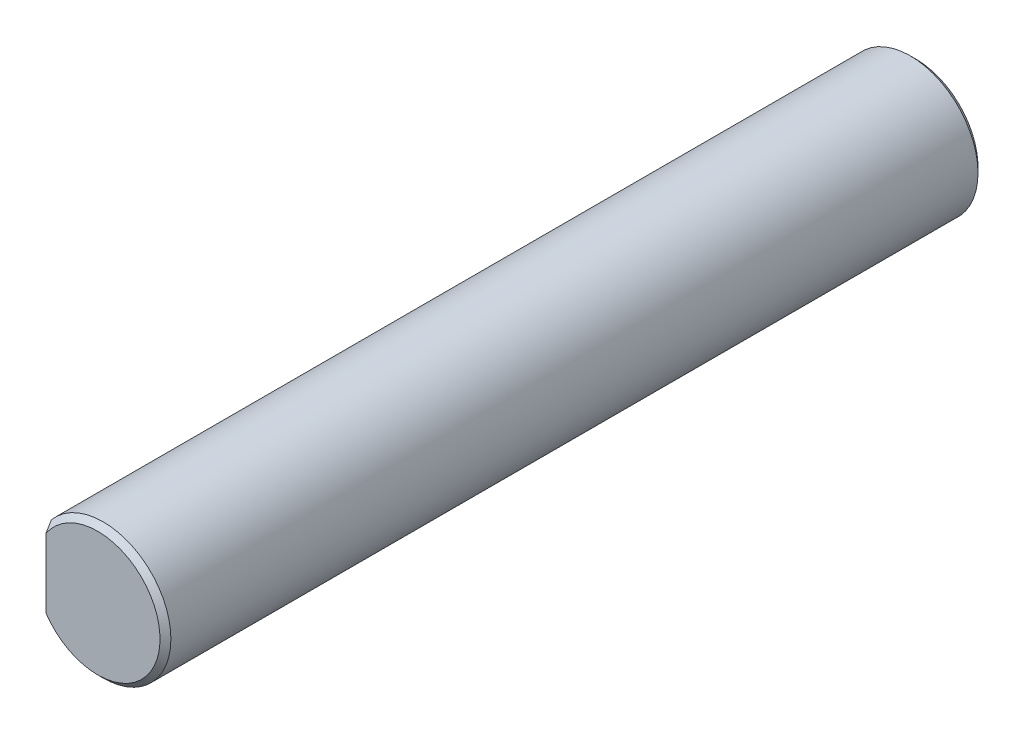
ISO-10303-21;
HEADER;
FILE_DESCRIPTION(('STEP AP214'),'2;1');
FILE_NAME('part.step','',(''),(''),'','','');
FILE_SCHEMA(('AUTOMOTIVE_DESIGN { 1 0 10303 214 1 1 1 1 }'));
ENDSEC;
DATA;
#1=APPLICATION_CONTEXT('core data for automotive mechanical design processes');
#2=APPLICATION_PROTOCOL_DEFINITION('international standard','automotive_design',2000,#1);
#3=PRODUCT_CONTEXT('',#1,'mechanical');
#4=PRODUCT('Part','Part','',(#3));
#5=PRODUCT_RELATED_PRODUCT_CATEGORY('part','',(#4));
#6=PRODUCT_DEFINITION_FORMATION('','',#4);
#7=PRODUCT_DEFINITION_CONTEXT('part definition',#1,'design');
#8=PRODUCT_DEFINITION('design','',#6,#7);
#9=PRODUCT_DEFINITION_SHAPE('','',#8);
#10=(LENGTH_UNIT() NAMED_UNIT(*) SI_UNIT(.MILLI.,.METRE.));
#11=(NAMED_UNIT(*) PLANE_ANGLE_UNIT() SI_UNIT($,.RADIAN.));
#12=(NAMED_UNIT(*) SI_UNIT($,.STERADIAN.) SOLID_ANGLE_UNIT());
#13=UNCERTAINTY_MEASURE_WITH_UNIT(LENGTH_MEASURE(1.E-05),#10,'distance_accuracy_value','');
#14=(GEOMETRIC_REPRESENTATION_CONTEXT(3) GLOBAL_UNCERTAINTY_ASSIGNED_CONTEXT((#13)) GLOBAL_UNIT_ASSIGNED_CONTEXT((#10,
#11,#12)) REPRESENTATION_CONTEXT('',''));
#15=CARTESIAN_POINT('',(0.,0.,0.));
#16=DIRECTION('',(0.,0.,1.));
#17=DIRECTION('',(1.,0.,0.));
#18=AXIS2_PLACEMENT_3D('',#15,#16,#17);
#19=CARTESIAN_POINT('',(-2.41046,0.,-38.1));
#20=DIRECTION('',(-1.,0.,0.));
#21=DIRECTION('',(0.,0.,1.));
#22=AXIS2_PLACEMENT_3D('',#19,#20,#21);
#23=PLANE('',#22);
#24=DIRECTION('',(0.,0.,1.));
#25=VECTOR('',#24,1.);
#26=CARTESIAN_POINT('',(-2.41046,2.032,-38.1));
#27=LINE('',#26,#25);
#28=CARTESIAN_POINT('',(-2.41046,2.032,-37.846));
#29=VERTEX_POINT('',#28);
#30=CARTESIAN_POINT('',(-2.41046,2.032,-0.253999999999997));
#31=VERTEX_POINT('',#30);
#32=EDGE_CURVE('E100',#29,#31,#27,.T.);
#33=ORIENTED_EDGE('',*,*,#32,.F.);
#34=CARTESIAN_POINT('',(-2.41046,2.032,-37.846));
#35=CARTESIAN_POINT('',(-2.41046,1.99748743817022,-37.8682433435493));
#36=CARTESIAN_POINT('',(-2.41046,1.96282434648468,-37.8902546669793));
#37=CARTESIAN_POINT('',(-2.41046,1.89318433308352,-37.9337539341622));
#38=CARTESIAN_POINT('',(-2.41046,1.85820749760305,-37.9552420160444));
#39=CARTESIAN_POINT('',(-2.41046,1.7879076047486,-37.9976481286313));
#40=CARTESIAN_POINT('',(-2.41046,1.75258453538703,-38.0185661395031));
#41=CARTESIAN_POINT('',(-2.41046,1.68156079208187,-38.0597727711167));
#42=CARTESIAN_POINT('',(-2.41046,1.64586001981038,-38.0800612222744));
#43=CARTESIAN_POINT('',(-2.41046,1.60996353059873,-38.1));
#44=B_SPLINE_CURVE_WITH_KNOTS('',3,(#34,#35,#36,#37,#38,#39,#40,#41,#42,#43),.UNSPECIFIED.,.F.,
.F.,(4,2,2,2,4),(0.,0.1231787926219,0.246324707092307,0.369474900393138,0.492657983593821),.UNSPECIFIED.);
#45=CARTESIAN_POINT('',(-2.41046,1.60996353059873,-38.1));
#46=VERTEX_POINT('',#45);
#47=EDGE_CURVE('E63',#29,#46,#44,.T.);
#48=ORIENTED_EDGE('',*,*,#47,.T.);
#49=DIRECTION('',(0.,-1.,0.));
#50=VECTOR('',#49,1.);
#51=CARTESIAN_POINT('',(-2.41046,0.,-38.1));
#52=LINE('',#51,#50);
#53=CARTESIAN_POINT('',(-2.41046,-1.60996353059873,-38.1));
#54=VERTEX_POINT('',#53);
#55=EDGE_CURVE('E86',#46,#54,#52,.T.);
#56=ORIENTED_EDGE('',*,*,#55,.T.);
#57=CARTESIAN_POINT('',(-2.41046,-1.60996353059873,-38.1));
#58=CARTESIAN_POINT('',(-2.41046,-1.64586001981038,-38.0800612222744));
#59=CARTESIAN_POINT('',(-2.41046,-1.68156079208187,-38.0597727711167));
#60=CARTESIAN_POINT('',(-2.41046,-1.75258453538703,-38.0185661395031));
#61=CARTESIAN_POINT('',(-2.41046,-1.7879076047486,-37.9976481286313));
#62=CARTESIAN_POINT('',(-2.41046,-1.85820749760305,-37.9552420160444));
#63=CARTESIAN_POINT('',(-2.41046,-1.89318433308352,-37.9337539341622));
#64=CARTESIAN_POINT('',(-2.41046,-1.96282434648468,-37.8902546669793));
#65=CARTESIAN_POINT('',(-2.41046,-1.99748743817021,-37.8682433435493));
#66=CARTESIAN_POINT('',(-2.41046,-2.032,-37.846));
#67=B_SPLINE_CURVE_WITH_KNOTS('',3,(#57,#58,#59,#60,#61,#62,#63,#64,#65,#66),.UNSPECIFIED.,.F.,
.F.,(4,2,2,2,4),(0.,0.123183083200684,0.246333276501515,0.369479190971921,0.492657983593823),.UNSPECIFIED.);
#68=CARTESIAN_POINT('',(-2.41046,-2.032,-37.846));
#69=VERTEX_POINT('',#68);
#70=EDGE_CURVE('E82',#54,#69,#67,.T.);
#71=ORIENTED_EDGE('',*,*,#70,.T.);
#72=DIRECTION('',(0.,0.,1.));
#73=VECTOR('',#72,1.);
#74=CARTESIAN_POINT('',(-2.41046,-2.032,-38.1));
#75=LINE('',#74,#73);
#76=CARTESIAN_POINT('',(-2.41046,-2.032,-0.253999999999997));
#77=VERTEX_POINT('',#76);
#78=EDGE_CURVE('E84',#69,#77,#75,.T.);
#79=ORIENTED_EDGE('',*,*,#78,.T.);
#80=CARTESIAN_POINT('',(-2.41046,-2.032,-0.253999999999983));
#81=CARTESIAN_POINT('',(-2.41046,-1.99748743817022,-0.231756656450727));
#82=CARTESIAN_POINT('',(-2.41046,-1.96282434648469,-0.209745333020728));
#83=CARTESIAN_POINT('',(-2.41046,-1.89318433308353,-0.166246065837788));
#84=CARTESIAN_POINT('',(-2.41046,-1.85820749760306,-0.144757983955608));
#85=CARTESIAN_POINT('',(-2.41046,-1.78790760474862,-0.102351871368673));
#86=CARTESIAN_POINT('',(-2.41046,-1.75258453538705,-0.0814338604968704));
#87=CARTESIAN_POINT('',(-2.41046,-1.6815607920819,-0.0402272288832523));
#88=CARTESIAN_POINT('',(-2.41046,-1.64586001981041,-0.0199387777255896));
#89=CARTESIAN_POINT('',(-2.41046,-1.60996353059876,0.));
#90=B_SPLINE_CURVE_WITH_KNOTS('',3,(#80,#81,#82,#83,#84,#85,#86,#87,#88,#89),.UNSPECIFIED.,.F.,
.F.,(4,2,2,2,4),(0.,0.123178792621893,0.246324707092288,0.369474900393113,0.492657983593786),.UNSPECIFIED.);
#91=CARTESIAN_POINT('',(-2.41046,-1.60996353059876,0.));
#92=VERTEX_POINT('',#91);
#93=EDGE_CURVE('E104',#77,#92,#90,.T.);
#94=ORIENTED_EDGE('',*,*,#93,.T.);
#95=DIRECTION('',(0.,-1.,0.));
#96=VECTOR('',#95,1.);
#97=CARTESIAN_POINT('',(-2.41046,0.,0.));
#98=LINE('',#97,#96);
#99=CARTESIAN_POINT('',(-2.41046,1.60996353059876,0.));
#100=VERTEX_POINT('',#99);
#101=EDGE_CURVE('E142',#100,#92,#98,.T.);
#102=ORIENTED_EDGE('',*,*,#101,.F.);
#103=CARTESIAN_POINT('',(-2.41046,1.60996353059876,0.));
#104=CARTESIAN_POINT('',(-2.41046,1.64586001981041,-0.0199387777255896));
#105=CARTESIAN_POINT('',(-2.41046,1.6815607920819,-0.0402272288832523));
#106=CARTESIAN_POINT('',(-2.41046,1.75258453538705,-0.0814338604968704));
#107=CARTESIAN_POINT('',(-2.41046,1.78790760474862,-0.102351871368673));
#108=CARTESIAN_POINT('',(-2.41046,1.85820749760306,-0.144757983955608));
#109=CARTESIAN_POINT('',(-2.41046,1.89318433308353,-0.166246065837788));
#110=CARTESIAN_POINT('',(-2.41046,1.96282434648469,-0.209745333020728));
#111=CARTESIAN_POINT('',(-2.41046,1.99748743817022,-0.231756656450727));
#112=CARTESIAN_POINT('',(-2.41046,2.032,-0.253999999999984));
#113=B_SPLINE_CURVE_WITH_KNOTS('',3,(#103,#104,#105,#106,#107,#108,#109,#110,#111,#112),
.UNSPECIFIED.,.F.,.F.,(4,2,2,2,4),(0.,0.123183083200674,0.246333276501498,0.369479190971894,
0.492657983593786),.UNSPECIFIED.);
#114=EDGE_CURVE('E90',#100,#31,#113,.T.);
#115=ORIENTED_EDGE('',*,*,#114,.T.);
#116=EDGE_LOOP('',(#33,#48,#56,#71,#79,#94,#102,#115));
#117=FACE_BOUND('',#116,.T.);
#118=ADVANCED_FACE('F41',(#117),#23,.T.);
#119=CARTESIAN_POINT('',(0.,0.,-38.1));
#120=DIRECTION('',(0.,0.,1.));
#121=DIRECTION('',(1.,0.,0.));
#122=AXIS2_PLACEMENT_3D('',#119,#120,#121);
#123=CYLINDRICAL_SURFACE('',#122,3.1526721065788);
#124=ORIENTED_EDGE('',*,*,#78,.F.);
#125=CARTESIAN_POINT('',(0.,0.,-37.846));
#126=DIRECTION('',(0.,0.,1.));
#127=DIRECTION('',(1.,0.,0.));
#128=AXIS2_PLACEMENT_3D('',#125,#126,#127);
#129=CIRCLE('',#128,3.1526721065788);
#130=EDGE_CURVE('E96',#69,#29,#129,.T.);
#131=ORIENTED_EDGE('',*,*,#130,.T.);
#132=ORIENTED_EDGE('',*,*,#32,.T.);
#133=CARTESIAN_POINT('',(0.,0.,-0.253999999999983));
#134=DIRECTION('',(0.,0.,1.));
#135=DIRECTION('',(1.,0.,0.));
#136=AXIS2_PLACEMENT_3D('',#133,#134,#135);
#137=CIRCLE('',#136,3.1526721065788);
#138=EDGE_CURVE('E98',#31,#77,#137,.F.);
#139=ORIENTED_EDGE('',*,*,#138,.T.);
#140=EDGE_LOOP('',(#124,#131,#132,#139));
#141=FACE_BOUND('',#140,.T.);
#142=ADVANCED_FACE('F94',(#141),#123,.T.);
#143=CARTESIAN_POINT('',(0.,0.,-38.1));
#144=DIRECTION('',(0.,0.,1.));
#145=DIRECTION('',(1.,0.,0.));
#146=AXIS2_PLACEMENT_3D('',#143,#144,#145);
#147=PLANE('',#146);
#148=ORIENTED_EDGE('',*,*,#55,.F.);
#149=CARTESIAN_POINT('',(0.,0.,-38.1));
#150=DIRECTION('',(0.,0.,1.));
#151=DIRECTION('',(1.,0.,0.));
#152=AXIS2_PLACEMENT_3D('',#149,#150,#151);
#153=CIRCLE('',#152,2.89867210657879);
#154=EDGE_CURVE('E51',#46,#54,#153,.F.);
#155=ORIENTED_EDGE('',*,*,#154,.T.);
#156=EDGE_LOOP('',(#148,#155));
#157=FACE_BOUND('',#156,.T.);
#158=ADVANCED_FACE('F154',(#157),#147,.F.);
#159=CARTESIAN_POINT('',(0.,0.,0.));
#160=DIRECTION('',(0.,0.,1.));
#161=DIRECTION('',(1.,0.,0.));
#162=AXIS2_PLACEMENT_3D('',#159,#160,#161);
#163=PLANE('',#162);
#164=ORIENTED_EDGE('',*,*,#101,.T.);
#165=CARTESIAN_POINT('',(0.,0.,0.));
#166=DIRECTION('',(0.,0.,1.));
#167=DIRECTION('',(1.,0.,0.));
#168=AXIS2_PLACEMENT_3D('',#165,#166,#167);
#169=CIRCLE('',#168,2.89867210657881);
#170=EDGE_CURVE('E11',#92,#100,#169,.T.);
#171=ORIENTED_EDGE('',*,*,#170,.T.);
#172=EDGE_LOOP('',(#164,#171));
#173=FACE_BOUND('',#172,.T.);
#174=ADVANCED_FACE('F148',(#173),#163,.T.);
#175=CARTESIAN_POINT('',(0.,0.,-37.846));
#176=DIRECTION('',(0.,0.,1.));
#177=DIRECTION('',(1.,0.,0.));
#178=AXIS2_PLACEMENT_3D('',#175,#176,#177);
#179=CONICAL_SURFACE('',#178,3.1526721065788,0.785398163397454);
#180=ORIENTED_EDGE('',*,*,#70,.F.);
#181=ORIENTED_EDGE('',*,*,#154,.F.);
#182=ORIENTED_EDGE('',*,*,#47,.F.);
#183=ORIENTED_EDGE('',*,*,#130,.F.);
#184=EDGE_LOOP('',(#180,#181,#182,#183));
#185=FACE_BOUND('',#184,.T.);
#186=ADVANCED_FACE('F102',(#185),#179,.T.);
#187=CARTESIAN_POINT('',(0.,0.,0.));
#188=DIRECTION('',(0.,0.,-1.));
#189=DIRECTION('',(-1.,0.,0.));
#190=AXIS2_PLACEMENT_3D('',#187,#188,#189);
#191=CONICAL_SURFACE('',#190,2.89867210657881,0.785398163397462);
#192=ORIENTED_EDGE('',*,*,#93,.F.);
#193=ORIENTED_EDGE('',*,*,#138,.F.);
#194=ORIENTED_EDGE('',*,*,#114,.F.);
#195=ORIENTED_EDGE('',*,*,#170,.F.);
#196=EDGE_LOOP('',(#192,#193,#194,#195));
#197=FACE_BOUND('',#196,.T.);
#198=ADVANCED_FACE('F43',(#197),#191,.T.);
#199=CLOSED_SHELL('',(#118,#142,#158,#174,#186,#198));
#200=MANIFOLD_SOLID_BREP('B2',#199);
#201=ADVANCED_BREP_SHAPE_REPRESENTATION('',(#18,#200),#14);
#202=SHAPE_DEFINITION_REPRESENTATION(#9,#201);
ENDSEC;
END-ISO-10303-21;
